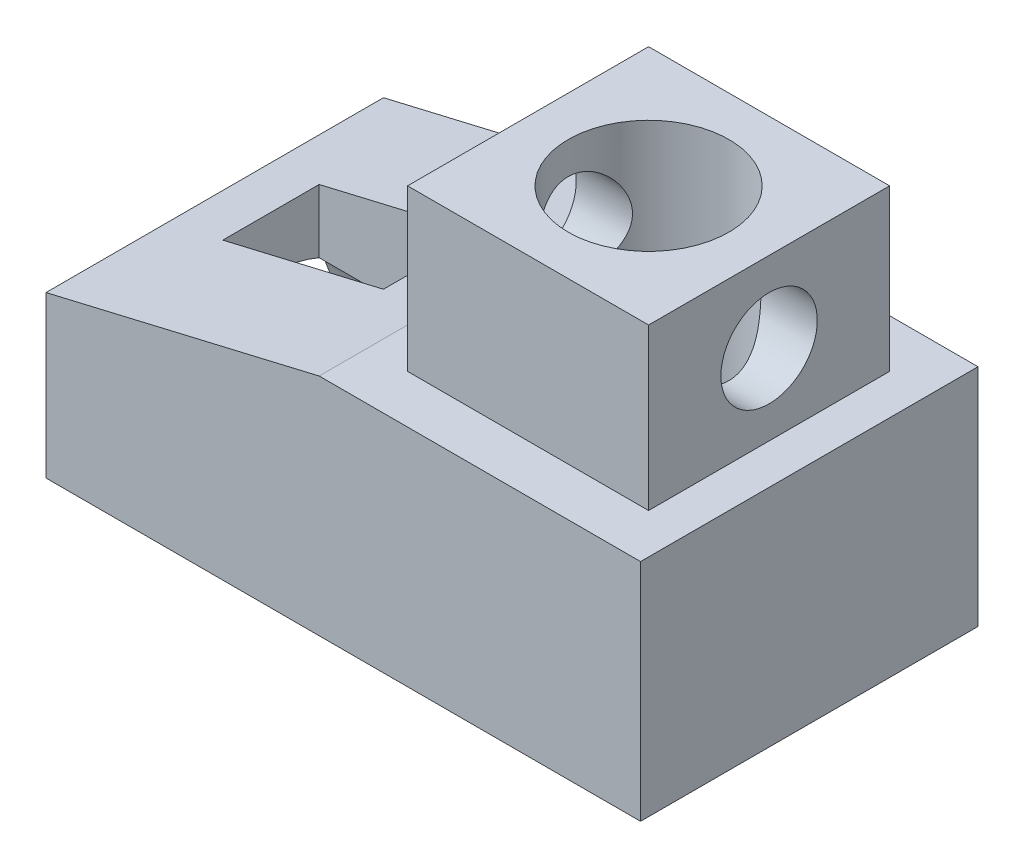
ISO-10303-21;
HEADER;
FILE_DESCRIPTION(('STEP AP214'),'2;1');
FILE_NAME('part.step','',(''),(''),'','','');
FILE_SCHEMA(('AUTOMOTIVE_DESIGN { 1 0 10303 214 1 1 1 1 }'));
ENDSEC;
DATA;
#1=APPLICATION_CONTEXT('core data for automotive mechanical design processes');
#2=APPLICATION_PROTOCOL_DEFINITION('international standard','automotive_design',2000,#1);
#3=PRODUCT_CONTEXT('',#1,'mechanical');
#4=PRODUCT('Part','Part','',(#3));
#5=PRODUCT_RELATED_PRODUCT_CATEGORY('part','',(#4));
#6=PRODUCT_DEFINITION_FORMATION('','',#4);
#7=PRODUCT_DEFINITION_CONTEXT('part definition',#1,'design');
#8=PRODUCT_DEFINITION('design','',#6,#7);
#9=PRODUCT_DEFINITION_SHAPE('','',#8);
#10=(LENGTH_UNIT() NAMED_UNIT(*) SI_UNIT(.MILLI.,.METRE.));
#11=(NAMED_UNIT(*) PLANE_ANGLE_UNIT() SI_UNIT($,.RADIAN.));
#12=(NAMED_UNIT(*) SI_UNIT($,.STERADIAN.) SOLID_ANGLE_UNIT());
#13=UNCERTAINTY_MEASURE_WITH_UNIT(LENGTH_MEASURE(1.E-05),#10,'distance_accuracy_value','');
#14=(GEOMETRIC_REPRESENTATION_CONTEXT(3) GLOBAL_UNCERTAINTY_ASSIGNED_CONTEXT((#13)) GLOBAL_UNIT_ASSIGNED_CONTEXT((#10,
#11,#12)) REPRESENTATION_CONTEXT('',''));
#15=CARTESIAN_POINT('',(0.,0.,0.));
#16=DIRECTION('',(0.,0.,1.));
#17=DIRECTION('',(1.,0.,0.));
#18=AXIS2_PLACEMENT_3D('',#15,#16,#17);
#19=CARTESIAN_POINT('',(81.,38.,21.));
#20=DIRECTION('',(-1.,0.,0.));
#21=DIRECTION('',(0.,0.,1.));
#22=AXIS2_PLACEMENT_3D('',#19,#20,#21);
#23=CYLINDRICAL_SURFACE('',#22,6.);
#24=CARTESIAN_POINT('',(62.,38.,27.));
#25=CARTESIAN_POINT('',(61.9999986491022,38.1509543565746,27.0000008816288));
#26=CARTESIAN_POINT('',(62.0042883367909,38.3018983145567,26.9942947185348));
#27=CARTESIAN_POINT('',(62.021248632191,38.602444063952,26.9715802959581));
#28=CARTESIAN_POINT('',(62.0339186819352,38.7520459440491,26.9545727889222));
#29=CARTESIAN_POINT('',(62.0671073495018,39.0487981017518,26.9095310849097));
#30=CARTESIAN_POINT('',(62.0876314862447,39.1959465793494,26.8814891338421));
#31=CARTESIAN_POINT('',(62.1356997097577,39.4866780912744,26.8148147656677));
#32=CARTESIAN_POINT('',(62.1632471209812,39.6302594016697,26.7761773325531));
#33=CARTESIAN_POINT('',(62.2544806861303,40.0521394481308,26.6457752185362));
#34=CARTESIAN_POINT('',(62.3270657253365,40.3240692031291,26.5391299189045));
#35=CARTESIAN_POINT('',(62.4874371155289,40.8457959775615,26.2901126299397));
#36=CARTESIAN_POINT('',(62.5752279984151,41.0955863650032,26.1477299838664));
#37=CARTESIAN_POINT('',(62.7691541156373,41.5998079108103,25.8108283424081));
#38=CARTESIAN_POINT('',(62.8762198499495,41.8510722444908,25.6120632809818));
#39=CARTESIAN_POINT('',(63.0358223123053,42.202012314778,25.2858687115547));
#40=CARTESIAN_POINT('',(63.08889374486,42.3147357489974,25.1723738032369));
#41=CARTESIAN_POINT('',(63.1935858740914,42.5311141830252,24.9363214663246));
#42=CARTESIAN_POINT('',(63.2452063019244,42.634767509735,24.8137623733853));
#43=CARTESIAN_POINT('',(63.3512969598774,42.8431024453444,24.5462842286701));
#44=CARTESIAN_POINT('',(63.4054690959747,42.9466763949603,24.4003817195654));
#45=CARTESIAN_POINT('',(63.5091026304158,43.1409905104534,24.0987702572981));
#46=CARTESIAN_POINT('',(63.5585661302045,43.231736410289,23.9430657307701));
#47=CARTESIAN_POINT('',(63.6513761573411,43.399438628316,23.6227331627158));
#48=CARTESIAN_POINT('',(63.6947253107895,43.4764008704179,23.458108994469));
#49=CARTESIAN_POINT('',(63.7740083496334,43.615559747051,23.1210186151927));
#50=CARTESIAN_POINT('',(63.8099434534883,43.6777588080855,22.9485536984429));
#51=CARTESIAN_POINT('',(63.8702153387099,43.7812406503287,22.6139788731018));
#52=CARTESIAN_POINT('',(63.8953316196824,43.8239528960747,22.4524510641763));
#53=CARTESIAN_POINT('',(63.9378378885394,43.8958855303524,22.1254138002954));
#54=CARTESIAN_POINT('',(63.9552283243657,43.9251067010959,21.9599045767679));
#55=CARTESIAN_POINT('',(63.9817559363516,43.9695703176477,21.6264934342495));
#56=CARTESIAN_POINT('',(63.9908995745911,43.9848237085646,21.4585934935768));
#57=CARTESIAN_POINT('',(64.0006753626941,44.0011292561628,21.1218645402546));
#58=CARTESIAN_POINT('',(64.001308378531,44.0021828577023,20.9530356238792));
#59=CARTESIAN_POINT('',(63.9945013490841,43.9908321342963,20.6370525959578));
#60=CARTESIAN_POINT('',(63.988055423997,43.9800850496281,20.4898138707286));
#61=CARTESIAN_POINT('',(63.9687793917165,43.9478341260844,20.1968909842558));
#62=CARTESIAN_POINT('',(63.9559472038078,43.9263267813845,20.0512073454886));
#63=CARTESIAN_POINT('',(63.9241981232537,43.8728332829292,19.762512301934));
#64=CARTESIAN_POINT('',(63.9052833685438,43.8408508109587,19.6194999768779));
#65=CARTESIAN_POINT('',(63.8617806390787,43.7667682162435,19.3369526643114));
#66=CARTESIAN_POINT('',(63.8371904755773,43.7246641898162,19.1974190414403));
#67=CARTESIAN_POINT('',(63.7827138055119,43.6305392014372,18.9219422869072));
#68=CARTESIAN_POINT('',(63.7527997106126,43.5784664703812,18.786022314486));
#69=CARTESIAN_POINT('',(63.6883732750741,43.4650477824947,18.5192153951276));
#70=CARTESIAN_POINT('',(63.6538592991051,43.4036985266659,18.3883302595779));
#71=CARTESIAN_POINT('',(63.5444115972231,43.2065161682298,18.004179941143));
#72=CARTESIAN_POINT('',(63.4635338585071,43.0574840347907,17.7592334652929));
#73=CARTESIAN_POINT('',(63.2815131317084,42.7086348713407,17.2676670530821));
#74=CARTESIAN_POINT('',(63.1791034522392,42.5048780951204,17.024341914746));
#75=CARTESIAN_POINT('',(62.9702060080898,42.0623521447699,16.5731247750403));
#76=CARTESIAN_POINT('',(62.863712870229,41.8235355818848,16.3652815686283));
#77=CARTESIAN_POINT('',(62.7022689464817,41.4272794048551,16.0720214989787));
#78=CARTESIAN_POINT('',(62.6453230939149,41.2804716711562,15.9730709842656));
#79=CARTESIAN_POINT('',(62.5350063250197,40.9776206053789,15.7879700328593));
#80=CARTESIAN_POINT('',(62.4816359973245,40.8215757605345,15.7018217009404));
#81=CARTESIAN_POINT('',(62.3805146003572,40.5012170022523,15.5432781474737));
#82=CARTESIAN_POINT('',(62.3327551522787,40.3369159555939,15.4708623170464));
#83=CARTESIAN_POINT('',(62.244794220076,40.000726632359,15.3405338020463));
#84=CARTESIAN_POINT('',(62.2045897684889,39.8288413676184,15.2826154201634));
#85=CARTESIAN_POINT('',(62.1424912892808,39.5221067252902,15.1946603056675));
#86=CARTESIAN_POINT('',(62.1185285023576,39.3886289376319,15.1612708760084));
#87=CARTESIAN_POINT('',(62.0767518417458,39.1187811646783,15.1036153800332));
#88=CARTESIAN_POINT('',(62.0589366105629,38.9824118249601,15.0793472994483));
#89=CARTESIAN_POINT('',(62.0300852439066,38.7077432735224,15.0402749388023));
#90=CARTESIAN_POINT('',(62.0190425991827,38.5694460459226,15.0254615710933));
#91=CARTESIAN_POINT('',(62.0041181849722,38.2917632824482,15.0054817203489));
#92=CARTESIAN_POINT('',(62.0002365673514,38.1523777235559,15.0003154419017));
#93=CARTESIAN_POINT('',(61.9997841667535,37.8733812778339,14.999712203597));
#94=CARTESIAN_POINT('',(62.00322344791,37.7337703447989,15.004288637172));
#95=CARTESIAN_POINT('',(62.017299675006,37.4555749038969,15.0231243878153));
#96=CARTESIAN_POINT('',(62.0279366584356,37.3169904013798,15.0373837553184));
#97=CARTESIAN_POINT('',(62.0560211591692,37.0417603550478,15.0753835591432));
#98=CARTESIAN_POINT('',(62.0734719572314,36.9051157781758,15.0991285627959));
#99=CARTESIAN_POINT('',(62.114568969023,36.634666944246,15.1557732694269));
#100=CARTESIAN_POINT('',(62.1382177117574,36.5008638707816,15.1886767097479));
#101=CARTESIAN_POINT('',(62.2172614819467,36.1052987729475,15.3004408422679));
#102=CARTESIAN_POINT('',(62.280824556243,35.8487461118599,15.3924452821131));
#103=CARTESIAN_POINT('',(62.4228619015266,35.3540524646882,15.6081520667899));
#104=CARTESIAN_POINT('',(62.5013417943129,35.1159184679258,15.7318663684708));
#105=CARTESIAN_POINT('',(62.6814821541945,34.6190272848439,16.0333220527565));
#106=CARTESIAN_POINT('',(62.7847709613025,34.3642915669707,16.2167825928053));
#107=CARTESIAN_POINT('',(62.9408207934403,34.0062804640016,16.5195194550488));
#108=CARTESIAN_POINT('',(62.9930647785964,33.8908780899056,16.6251160825031));
#109=CARTESIAN_POINT('',(63.0968447625405,33.6684568173622,16.8452196341281));
#110=CARTESIAN_POINT('',(63.1483806343748,33.5614394064447,16.9597281321544));
#111=CARTESIAN_POINT('',(63.2562394949588,33.3429474632705,17.2127408347878));
#112=CARTESIAN_POINT('',(63.3123098000297,33.2327130882487,17.3524265517845));
#113=CARTESIAN_POINT('',(63.4205941057635,33.0245106777257,17.6419820196453));
#114=CARTESIAN_POINT('',(63.4728096631209,32.9265376793757,17.7918476120174));
#115=CARTESIAN_POINT('',(63.5719536933945,32.743747353506,18.1010263284484));
#116=CARTESIAN_POINT('',(63.6188833561554,32.6589270637114,18.2603373139943));
#117=CARTESIAN_POINT('',(63.7060941907275,32.503418338219,18.5874551187184));
#118=CARTESIAN_POINT('',(63.7463762688217,32.432727975872,18.7552607757122));
#119=CARTESIAN_POINT('',(63.8164030937902,32.3110581490883,19.0856738300527));
#120=CARTESIAN_POINT('',(63.8467005700425,32.2590201922606,19.2477740092927));
#121=CARTESIAN_POINT('',(63.8996382046549,32.1686898439974,19.5769929290668));
#122=CARTESIAN_POINT('',(63.9222786478498,32.130396941255,19.7441114826701));
#123=CARTESIAN_POINT('',(63.9591988761294,32.068198543343,20.0817561638988));
#124=CARTESIAN_POINT('',(63.9734865352764,32.0442794975272,20.2522789250538));
#125=CARTESIAN_POINT('',(63.9932810158827,32.0111901039498,20.5952482719609));
#126=CARTESIAN_POINT('',(63.9987889820075,32.002017833554,20.767694603972));
#127=CARTESIAN_POINT('',(64.0007158823897,31.9988073305453,21.0897214575485));
#128=CARTESIAN_POINT('',(63.9982501410171,32.0029120029425,21.2392808698848));
#129=CARTESIAN_POINT('',(63.9866626014441,32.022250322847,21.5374189927015));
#130=CARTESIAN_POINT('',(63.9775409702157,32.037483691176,21.6859977276892));
#131=CARTESIAN_POINT('',(63.952860128368,32.0788768012088,21.9810691741033));
#132=CARTESIAN_POINT('',(63.9373012306182,32.105036011886,22.1275619865536));
#133=CARTESIAN_POINT('',(63.9001089462329,32.1679506204853,22.417464039973));
#134=CARTESIAN_POINT('',(63.8784753775416,32.2047063359818,22.5608731883872));
#135=CARTESIAN_POINT('',(63.8300129482367,32.2877086715288,22.8414045113159));
#136=CARTESIAN_POINT('',(63.8032745244508,32.3337908137989,22.9785910626981));
#137=CARTESIAN_POINT('',(63.7449368081526,32.4353336059767,23.2483976665547));
#138=CARTESIAN_POINT('',(63.7133359421389,32.4907972923599,23.3810162237493));
#139=CARTESIAN_POINT('',(63.6121565237022,32.6705139558693,23.7709911869535));
#140=CARTESIAN_POINT('',(63.5361657432808,32.8081516823146,24.0206641926172));
#141=CARTESIAN_POINT('',(63.3637341877833,33.131708059679,24.5210906583849));
#142=CARTESIAN_POINT('',(63.2659689306676,33.3212460023392,24.7690189108485));
#143=CARTESIAN_POINT('',(63.0640611320437,33.7350410007379,25.2316059300312));
#144=CARTESIAN_POINT('',(62.9599116037015,33.9593365198765,25.4462273056391));
#145=CARTESIAN_POINT('',(62.7990921712019,34.3340942275925,25.753066995132));
#146=CARTESIAN_POINT('',(62.7415263703341,34.4740909355688,25.8578442024867));
#147=CARTESIAN_POINT('',(62.6288705170943,34.7634621679812,26.0552437102908));
#148=CARTESIAN_POINT('',(62.5737810751154,34.9128389829893,26.1478630246498));
#149=CARTESIAN_POINT('',(62.467931695323,35.2203071623597,26.320184828098));
#150=CARTESIAN_POINT('',(62.4171712117372,35.378397424027,26.3998889466109));
#151=CARTESIAN_POINT('',(62.3219291443925,35.7025090858776,26.5455447710769));
#152=CARTESIAN_POINT('',(62.277443346982,35.8685250624509,26.6115057203459));
#153=CARTESIAN_POINT('',(62.2001088883765,36.1932108824995,26.7238508101942));
#154=CARTESIAN_POINT('',(62.1665934341749,36.351310546738,26.771420455495));
#155=CARTESIAN_POINT('',(62.1078973905326,36.6722735524312,26.8535934546686));
#156=CARTESIAN_POINT('',(62.082711372931,36.8351337159181,26.8882052549119));
#157=CARTESIAN_POINT('',(62.041900383236,37.1640903371109,26.9438231296306));
#158=CARTESIAN_POINT('',(62.0262603426594,37.3301812650538,26.9648506501999));
#159=CARTESIAN_POINT('',(62.0053115524223,37.6641859048316,26.9929377161358));
#160=CARTESIAN_POINT('',(62.0000015025506,37.8320993845906,26.9999990193988));
#161=CARTESIAN_POINT('',(62.,38.,27.));
#162=B_SPLINE_CURVE_WITH_KNOTS('',3,(#24,#25,#26,#27,#28,#29,#30,#31,#32,#33,#34,#35,#36,#37,
#38,#39,#40,#41,#42,#43,#44,#45,#46,#47,#48,#49,#50,#51,#52,#53,#54,#55,#56,#57,#58,#59,#60,#61,
#62,#63,#64,#65,#66,#67,#68,#69,#70,#71,#72,#73,#74,#75,#76,#77,#78,#79,#80,#81,#82,#83,#84,#85,
#86,#87,#88,#89,#90,#91,#92,#93,#94,#95,#96,#97,#98,#99,#100,#101,#102,#103,#104,#105,#106,#107,
#108,#109,#110,#111,#112,#113,#114,#115,#116,#117,#118,#119,#120,#121,#122,#123,#124,#125,#126,
#127,#128,#129,#130,#131,#132,#133,#134,#135,#136,#137,#138,#139,#140,#141,#142,#143,#144,#145,
#146,#147,#148,#149,#150,#151,#152,#153,#154,#155,#156,#157,#158,#159,#160,#161),.UNSPECIFIED.,
.T.,.F.,(4,2,2,2,2,2,2,2,2,2,2,2,2,2,2,2,2,2,2,2,2,2,2,2,2,2,2,2,2,2,2,2,2,2,2,2,2,2,2,2,2,2,2,
2,2,2,2,2,2,2,2,2,2,2,2,2,2,2,2,2,2,2,2,2,2,2,2,2,4),(0.,0.452678131953077,0.905326127479809,
1.35829277610848,1.81147423500294,2.71030243772274,3.60939898666924,4.61842643340733,
5.12364477538536,5.62895611582987,6.18907007252824,6.7489328690842,7.30855446857233,
7.86808402384475,8.37422610792176,8.88033884221517,9.38605464793526,9.89171899563242,
10.3345024918992,10.777430346487,11.2202026880973,11.6631460729563,12.1084553973056,
12.5539234605076,13.4442631938077,14.4409496612456,15.4389959252679,15.9963343187221,
16.5537642416308,17.1103508709196,17.6667184242242,18.0852817260551,18.5037525421122,
18.9218205257131,19.3398973752831,19.7585493316179,20.1772034685705,20.5960594308092,
21.0150865695569,21.8512278120472,22.6876848036401,23.6749363767384,24.1693355999537,
24.6638223341295,25.2228243825863,25.7815994355499,26.3402484569055,26.8988212531045,
27.4168373395204,27.9348341540781,28.4523418690018,28.9697821075672,29.4181370808688,
29.8664808069716,30.3148027448461,30.7631381201982,31.2041651922951,31.6453352834275,
32.5270550916606,33.5044950178567,34.4830244255554,35.0347612934609,35.5866334204804,
36.1384358671919,36.6898659785695,37.1945532695295,37.6989110127382,38.2024705458659,
38.7059666930588),.UNSPECIFIED.);
#163=CARTESIAN_POINT('',(62.,38.,27.));
#164=VERTEX_POINT('',#163);
#165=EDGE_CURVE('E439',#164,#164,#162,.T.);
#166=ORIENTED_EDGE('',*,*,#165,.T.);
#167=EDGE_LOOP('',(#166));
#168=FACE_BOUND('',#167,.T.);
#169=CARTESIAN_POINT('',(69.,38.,21.));
#170=DIRECTION('',(-1.,0.,0.));
#171=DIRECTION('',(0.,0.,1.));
#172=AXIS2_PLACEMENT_3D('',#169,#170,#171);
#173=CIRCLE('',#172,6.);
#174=CARTESIAN_POINT('',(69.,38.,27.));
#175=VERTEX_POINT('',#174);
#176=EDGE_CURVE('E208',#175,#175,#173,.T.);
#177=ORIENTED_EDGE('',*,*,#176,.F.);
#178=EDGE_LOOP('',(#177));
#179=FACE_BOUND('',#178,.T.);
#180=ADVANCED_FACE('F44',(#168,#179),#23,.F.);
#181=CARTESIAN_POINT('',(69.,48.,42.));
#182=DIRECTION('',(-1.,0.,0.));
#183=DIRECTION('',(0.,0.,1.));
#184=AXIS2_PLACEMENT_3D('',#181,#182,#183);
#185=PLANE('',#184);
#186=ORIENTED_EDGE('',*,*,#176,.T.);
#187=EDGE_LOOP('',(#186));
#188=FACE_BOUND('',#187,.T.);
#189=DIRECTION('',(0.,-1.,0.));
#190=VECTOR('',#189,1.);
#191=CARTESIAN_POINT('',(69.,0.,6.));
#192=LINE('',#191,#190);
#193=CARTESIAN_POINT('',(69.,48.,6.));
#194=VERTEX_POINT('',#193);
#195=CARTESIAN_POINT('',(69.,28.,6.));
#196=VERTEX_POINT('',#195);
#197=EDGE_CURVE('E212',#194,#196,#192,.T.);
#198=ORIENTED_EDGE('',*,*,#197,.F.);
#199=DIRECTION('',(0.,0.,-1.));
#200=VECTOR('',#199,1.);
#201=CARTESIAN_POINT('',(69.,48.,42.));
#202=LINE('',#201,#200);
#203=CARTESIAN_POINT('',(69.,48.,36.));
#204=VERTEX_POINT('',#203);
#205=EDGE_CURVE('E305',#204,#194,#202,.T.);
#206=ORIENTED_EDGE('',*,*,#205,.F.);
#207=DIRECTION('',(0.,1.,0.));
#208=VECTOR('',#207,1.);
#209=CARTESIAN_POINT('',(69.,0.,36.));
#210=LINE('',#209,#208);
#211=CARTESIAN_POINT('',(69.,28.,36.));
#212=VERTEX_POINT('',#211);
#213=EDGE_CURVE('E231',#212,#204,#210,.T.);
#214=ORIENTED_EDGE('',*,*,#213,.F.);
#215=DIRECTION('',(0.,0.,-1.));
#216=VECTOR('',#215,1.);
#217=CARTESIAN_POINT('',(69.,28.,42.));
#218=LINE('',#217,#216);
#219=EDGE_CURVE('E309',#212,#196,#218,.T.);
#220=ORIENTED_EDGE('',*,*,#219,.T.);
#221=EDGE_LOOP('',(#198,#206,#214,#220));
#222=FACE_BOUND('',#221,.T.);
#223=ADVANCED_FACE('F375',(#188,#222),#185,.F.);
#224=CARTESIAN_POINT('',(39.,48.,42.));
#225=DIRECTION('',(0.,-1.,0.));
#226=DIRECTION('',(0.,0.,-1.));
#227=AXIS2_PLACEMENT_3D('',#224,#225,#226);
#228=PLANE('',#227);
#229=CARTESIAN_POINT('',(54.,48.,21.));
#230=DIRECTION('',(0.,1.,0.));
#231=DIRECTION('',(0.,0.,1.));
#232=AXIS2_PLACEMENT_3D('',#229,#230,#231);
#233=CIRCLE('',#232,9.99999999999999);
#234=CARTESIAN_POINT('',(54.,48.,31.));
#235=VERTEX_POINT('',#234);
#236=EDGE_CURVE('E445',#235,#235,#233,.T.);
#237=ORIENTED_EDGE('',*,*,#236,.F.);
#238=EDGE_LOOP('',(#237));
#239=FACE_BOUND('',#238,.T.);
#240=DIRECTION('',(1.,0.,0.));
#241=VECTOR('',#240,1.);
#242=CARTESIAN_POINT('',(0.,48.,6.));
#243=LINE('',#242,#241);
#244=CARTESIAN_POINT('',(39.,48.,6.));
#245=VERTEX_POINT('',#244);
#246=EDGE_CURVE('E222',#245,#194,#243,.T.);
#247=ORIENTED_EDGE('',*,*,#246,.F.);
#248=DIRECTION('',(0.,0.,-1.));
#249=VECTOR('',#248,1.);
#250=CARTESIAN_POINT('',(39.,48.,42.));
#251=LINE('',#250,#249);
#252=CARTESIAN_POINT('',(39.,48.,36.));
#253=VERTEX_POINT('',#252);
#254=EDGE_CURVE('E301',#253,#245,#251,.T.);
#255=ORIENTED_EDGE('',*,*,#254,.F.);
#256=DIRECTION('',(-1.,0.,0.));
#257=VECTOR('',#256,1.);
#258=CARTESIAN_POINT('',(0.,48.,36.));
#259=LINE('',#258,#257);
#260=EDGE_CURVE('E66',#204,#253,#259,.T.);
#261=ORIENTED_EDGE('',*,*,#260,.F.);
#262=ORIENTED_EDGE('',*,*,#205,.T.);
#263=EDGE_LOOP('',(#247,#255,#261,#262));
#264=FACE_BOUND('',#263,.T.);
#265=ADVANCED_FACE('F383',(#239,#264),#228,.F.);
#266=CARTESIAN_POINT('',(39.,48.,42.));
#267=DIRECTION('',(1.,0.,0.));
#268=DIRECTION('',(0.,0.,-1.));
#269=AXIS2_PLACEMENT_3D('',#266,#267,#268);
#270=PLANE('',#269);
#271=CARTESIAN_POINT('',(39.,38.,21.));
#272=DIRECTION('',(-1.,0.,0.));
#273=DIRECTION('',(0.,0.,1.));
#274=AXIS2_PLACEMENT_3D('',#271,#272,#273);
#275=CIRCLE('',#274,6.);
#276=CARTESIAN_POINT('',(39.,38.,27.));
#277=VERTEX_POINT('',#276);
#278=EDGE_CURVE('E204',#277,#277,#275,.T.);
#279=ORIENTED_EDGE('',*,*,#278,.F.);
#280=EDGE_LOOP('',(#279));
#281=FACE_BOUND('',#280,.T.);
#282=DIRECTION('',(0.,1.,0.));
#283=VECTOR('',#282,1.);
#284=CARTESIAN_POINT('',(39.,0.,6.));
#285=LINE('',#284,#283);
#286=CARTESIAN_POINT('',(39.,28.,6.));
#287=VERTEX_POINT('',#286);
#288=EDGE_CURVE('E219',#287,#245,#285,.T.);
#289=ORIENTED_EDGE('',*,*,#288,.F.);
#290=DIRECTION('',(0.,0.,-1.));
#291=VECTOR('',#290,1.);
#292=CARTESIAN_POINT('',(39.,28.,42.));
#293=LINE('',#292,#291);
#294=CARTESIAN_POINT('',(39.,28.,36.));
#295=VERTEX_POINT('',#294);
#296=EDGE_CURVE('E284',#295,#287,#293,.T.);
#297=ORIENTED_EDGE('',*,*,#296,.F.);
#298=DIRECTION('',(0.,-1.,0.));
#299=VECTOR('',#298,1.);
#300=CARTESIAN_POINT('',(39.,0.,36.));
#301=LINE('',#300,#299);
#302=EDGE_CURVE('E225',#253,#295,#301,.T.);
#303=ORIENTED_EDGE('',*,*,#302,.F.);
#304=ORIENTED_EDGE('',*,*,#254,.T.);
#305=EDGE_LOOP('',(#289,#297,#303,#304));
#306=FACE_BOUND('',#305,.T.);
#307=ADVANCED_FACE('F407',(#281,#306),#270,.F.);
#308=CARTESIAN_POINT('',(0.,0.,42.));
#309=DIRECTION('',(1.,0.,0.));
#310=DIRECTION('',(0.,0.,-1.));
#311=AXIS2_PLACEMENT_3D('',#308,#309,#310);
#312=PLANE('',#311);
#313=DIRECTION('',(0.,0.,-1.));
#314=VECTOR('',#313,1.);
#315=CARTESIAN_POINT('',(0.,0.,42.));
#316=LINE('',#315,#314);
#317=CARTESIAN_POINT('',(0.,0.,6.));
#318=VERTEX_POINT('',#317);
#319=CARTESIAN_POINT('',(0.,0.,0.));
#320=VERTEX_POINT('',#319);
#321=EDGE_CURVE('E321',#318,#320,#316,.T.);
#322=ORIENTED_EDGE('',*,*,#321,.F.);
#323=CARTESIAN_POINT('',(0.,0.,21.));
#324=DIRECTION('',(-1.,0.,0.));
#325=DIRECTION('',(0.,0.,1.));
#326=AXIS2_PLACEMENT_3D('',#323,#324,#325);
#327=CIRCLE('',#326,15.);
#328=CARTESIAN_POINT('',(0.,0.,36.));
#329=VERTEX_POINT('',#328);
#330=EDGE_CURVE('E443',#329,#318,#327,.T.);
#331=ORIENTED_EDGE('',*,*,#330,.F.);
#332=CARTESIAN_POINT('',(0.,0.,42.));
#333=VERTEX_POINT('',#332);
#334=EDGE_CURVE('E59',#333,#329,#316,.T.);
#335=ORIENTED_EDGE('',*,*,#334,.F.);
#336=DIRECTION('',(0.,-1.,0.));
#337=VECTOR('',#336,1.);
#338=CARTESIAN_POINT('',(0.,0.,42.));
#339=LINE('',#338,#337);
#340=CARTESIAN_POINT('',(0.,20.,42.));
#341=VERTEX_POINT('',#340);
#342=EDGE_CURVE('E271',#341,#333,#339,.T.);
#343=ORIENTED_EDGE('',*,*,#342,.F.);
#344=DIRECTION('',(0.,0.,1.));
#345=VECTOR('',#344,1.);
#346=CARTESIAN_POINT('',(0.,20.,-3.));
#347=LINE('',#346,#345);
#348=CARTESIAN_POINT('',(0.,20.,0.));
#349=VERTEX_POINT('',#348);
#350=EDGE_CURVE('E240',#349,#341,#347,.T.);
#351=ORIENTED_EDGE('',*,*,#350,.F.);
#352=DIRECTION('',(0.,-1.,0.));
#353=VECTOR('',#352,1.);
#354=CARTESIAN_POINT('',(0.,0.,0.));
#355=LINE('',#354,#353);
#356=EDGE_CURVE('E172',#349,#320,#355,.T.);
#357=ORIENTED_EDGE('',*,*,#356,.T.);
#358=EDGE_LOOP('',(#322,#331,#335,#343,#351,#357));
#359=FACE_BOUND('',#358,.T.);
#360=ADVANCED_FACE('F46',(#359),#312,.F.);
#361=CARTESIAN_POINT('',(0.,0.,42.));
#362=DIRECTION('',(0.,0.,-1.));
#363=DIRECTION('',(-1.,0.,0.));
#364=AXIS2_PLACEMENT_3D('',#361,#362,#363);
#365=PLANE('',#364);
#366=DIRECTION('',(-1.,0.,0.));
#367=VECTOR('',#366,1.);
#368=CARTESIAN_POINT('',(69.,28.,42.));
#369=LINE('',#368,#367);
#370=CARTESIAN_POINT('',(74.,28.,42.));
#371=VERTEX_POINT('',#370);
#372=CARTESIAN_POINT('',(34.0000000000001,28.,42.));
#373=VERTEX_POINT('',#372);
#374=EDGE_CURVE('E281',#371,#373,#369,.T.);
#375=ORIENTED_EDGE('',*,*,#374,.T.);
#376=DIRECTION('',(-0.973417168333576,-0.229039333725547,0.));
#377=VECTOR('',#376,1.);
#378=CARTESIAN_POINT('',(-4.45901639344262,18.9508196721311,42.));
#379=LINE('',#378,#377);
#380=EDGE_CURVE('E236',#373,#341,#379,.T.);
#381=ORIENTED_EDGE('',*,*,#380,.T.);
#382=ORIENTED_EDGE('',*,*,#342,.T.);
#383=DIRECTION('',(1.,0.,0.));
#384=VECTOR('',#383,1.);
#385=CARTESIAN_POINT('',(0.,0.,42.));
#386=LINE('',#385,#384);
#387=CARTESIAN_POINT('',(74.,0.,42.));
#388=VERTEX_POINT('',#387);
#389=EDGE_CURVE('E274',#333,#388,#386,.T.);
#390=ORIENTED_EDGE('',*,*,#389,.T.);
#391=DIRECTION('',(0.,1.,0.));
#392=VECTOR('',#391,1.);
#393=CARTESIAN_POINT('',(74.,0.,42.));
#394=LINE('',#393,#392);
#395=EDGE_CURVE('E278',#388,#371,#394,.T.);
#396=ORIENTED_EDGE('',*,*,#395,.T.);
#397=EDGE_LOOP('',(#375,#381,#382,#390,#396));
#398=FACE_BOUND('',#397,.T.);
#399=ADVANCED_FACE('F345',(#398),#365,.F.);
#400=CARTESIAN_POINT('',(0.,0.,0.));
#401=DIRECTION('',(0.,0.,-1.));
#402=DIRECTION('',(-1.,0.,0.));
#403=AXIS2_PLACEMENT_3D('',#400,#401,#402);
#404=PLANE('',#403);
#405=DIRECTION('',(-1.,0.,0.));
#406=VECTOR('',#405,1.);
#407=CARTESIAN_POINT('',(0.,28.,0.));
#408=LINE('',#407,#406);
#409=CARTESIAN_POINT('',(74.,28.,0.));
#410=VERTEX_POINT('',#409);
#411=CARTESIAN_POINT('',(34.0000000000001,28.,0.));
#412=VERTEX_POINT('',#411);
#413=EDGE_CURVE('E275',#410,#412,#408,.T.);
#414=ORIENTED_EDGE('',*,*,#413,.F.);
#415=DIRECTION('',(0.,1.,0.));
#416=VECTOR('',#415,1.);
#417=CARTESIAN_POINT('',(74.,0.,0.));
#418=LINE('',#417,#416);
#419=CARTESIAN_POINT('',(74.,0.,0.));
#420=VERTEX_POINT('',#419);
#421=EDGE_CURVE('E291',#420,#410,#418,.T.);
#422=ORIENTED_EDGE('',*,*,#421,.F.);
#423=DIRECTION('',(1.,0.,0.));
#424=VECTOR('',#423,1.);
#425=CARTESIAN_POINT('',(0.,0.,0.));
#426=LINE('',#425,#424);
#427=EDGE_CURVE('E288',#320,#420,#426,.T.);
#428=ORIENTED_EDGE('',*,*,#427,.F.);
#429=ORIENTED_EDGE('',*,*,#356,.F.);
#430=DIRECTION('',(0.973417168333576,0.229039333725547,0.));
#431=VECTOR('',#430,1.);
#432=CARTESIAN_POINT('',(-4.45901639344262,18.9508196721311,0.));
#433=LINE('',#432,#431);
#434=EDGE_CURVE('E257',#349,#412,#433,.T.);
#435=ORIENTED_EDGE('',*,*,#434,.T.);
#436=EDGE_LOOP('',(#414,#422,#428,#429,#435));
#437=FACE_BOUND('',#436,.T.);
#438=ADVANCED_FACE('F335',(#437),#404,.T.);
#439=CARTESIAN_POINT('',(7.,-14.,27.));
#440=DIRECTION('',(0.,0.,1.));
#441=DIRECTION('',(1.,0.,0.));
#442=AXIS2_PLACEMENT_3D('',#439,#440,#441);
#443=PLANE('',#442);
#444=DIRECTION('',(0.,1.,0.));
#445=VECTOR('',#444,1.);
#446=CARTESIAN_POINT('',(27.,-14.,27.));
#447=LINE('',#446,#445);
#448=CARTESIAN_POINT('',(27.,13.7477270848675,27.));
#449=VERTEX_POINT('',#448);
#450=CARTESIAN_POINT('',(27.,26.3529411764706,27.));
#451=VERTEX_POINT('',#450);
#452=EDGE_CURVE('E260',#449,#451,#447,.T.);
#453=ORIENTED_EDGE('',*,*,#452,.F.);
#454=DIRECTION('',(-1.,0.,0.));
#455=VECTOR('',#454,1.);
#456=CARTESIAN_POINT('',(27.,13.7477270848675,27.));
#457=LINE('',#456,#455);
#458=CARTESIAN_POINT('',(7.,13.7477270848675,27.));
#459=VERTEX_POINT('',#458);
#460=EDGE_CURVE('E180',#449,#459,#457,.T.);
#461=ORIENTED_EDGE('',*,*,#460,.T.);
#462=DIRECTION('',(0.,1.,0.));
#463=VECTOR('',#462,1.);
#464=CARTESIAN_POINT('',(7.,-14.,27.));
#465=LINE('',#464,#463);
#466=CARTESIAN_POINT('',(7.,21.6470588235294,27.));
#467=VERTEX_POINT('',#466);
#468=EDGE_CURVE('E173',#459,#467,#465,.T.);
#469=ORIENTED_EDGE('',*,*,#468,.T.);
#470=DIRECTION('',(-0.973417168333576,-0.229039333725547,0.));
#471=VECTOR('',#470,1.);
#472=CARTESIAN_POINT('',(-0.94754098360655,19.7770491803279,27.));
#473=LINE('',#472,#471);
#474=EDGE_CURVE('E253',#451,#467,#473,.T.);
#475=ORIENTED_EDGE('',*,*,#474,.F.);
#476=EDGE_LOOP('',(#453,#461,#469,#475));
#477=FACE_BOUND('',#476,.T.);
#478=ADVANCED_FACE('F363',(#477),#443,.F.);
#479=CARTESIAN_POINT('',(7.,-14.,15.));
#480=DIRECTION('',(-1.,0.,0.));
#481=DIRECTION('',(0.,0.,1.));
#482=AXIS2_PLACEMENT_3D('',#479,#480,#481);
#483=PLANE('',#482);
#484=ORIENTED_EDGE('',*,*,#468,.F.);
#485=CARTESIAN_POINT('',(7.,0.,21.));
#486=DIRECTION('',(-1.,0.,0.));
#487=DIRECTION('',(0.,0.,1.));
#488=AXIS2_PLACEMENT_3D('',#485,#486,#487);
#489=CIRCLE('',#488,15.);
#490=CARTESIAN_POINT('',(7.,13.7477270848675,15.));
#491=VERTEX_POINT('',#490);
#492=EDGE_CURVE('E198',#459,#491,#489,.T.);
#493=ORIENTED_EDGE('',*,*,#492,.T.);
#494=DIRECTION('',(0.,1.,0.));
#495=VECTOR('',#494,1.);
#496=CARTESIAN_POINT('',(7.,-14.,15.));
#497=LINE('',#496,#495);
#498=CARTESIAN_POINT('',(7.,21.6470588235294,15.));
#499=VERTEX_POINT('',#498);
#500=EDGE_CURVE('E263',#491,#499,#497,.T.);
#501=ORIENTED_EDGE('',*,*,#500,.T.);
#502=DIRECTION('',(0.,0.,-1.));
#503=VECTOR('',#502,1.);
#504=CARTESIAN_POINT('',(7.,21.6470588235294,15.));
#505=LINE('',#504,#503);
#506=EDGE_CURVE('E249',#467,#499,#505,.T.);
#507=ORIENTED_EDGE('',*,*,#506,.F.);
#508=EDGE_LOOP('',(#484,#493,#501,#507));
#509=FACE_BOUND('',#508,.T.);
#510=ADVANCED_FACE('F358',(#509),#483,.F.);
#511=CARTESIAN_POINT('',(7.,-14.,15.));
#512=DIRECTION('',(0.,0.,1.));
#513=DIRECTION('',(1.,0.,0.));
#514=AXIS2_PLACEMENT_3D('',#511,#512,#513);
#515=PLANE('',#514);
#516=DIRECTION('',(-1.,0.,0.));
#517=VECTOR('',#516,1.);
#518=CARTESIAN_POINT('',(27.,13.7477270848675,15.));
#519=LINE('',#518,#517);
#520=CARTESIAN_POINT('',(27.,13.7477270848675,15.));
#521=VERTEX_POINT('',#520);
#522=EDGE_CURVE('E192',#521,#491,#519,.T.);
#523=ORIENTED_EDGE('',*,*,#522,.F.);
#524=DIRECTION('',(0.,1.,0.));
#525=VECTOR('',#524,1.);
#526=CARTESIAN_POINT('',(27.,-14.,15.));
#527=LINE('',#526,#525);
#528=CARTESIAN_POINT('',(27.,26.3529411764706,15.));
#529=VERTEX_POINT('',#528);
#530=EDGE_CURVE('E266',#521,#529,#527,.T.);
#531=ORIENTED_EDGE('',*,*,#530,.T.);
#532=DIRECTION('',(-0.973417168333576,-0.229039333725547,0.));
#533=VECTOR('',#532,1.);
#534=CARTESIAN_POINT('',(-0.947540983606551,19.7770491803279,15.));
#535=LINE('',#534,#533);
#536=EDGE_CURVE('E243',#529,#499,#535,.T.);
#537=ORIENTED_EDGE('',*,*,#536,.T.);
#538=ORIENTED_EDGE('',*,*,#500,.F.);
#539=EDGE_LOOP('',(#523,#531,#537,#538));
#540=FACE_BOUND('',#539,.T.);
#541=ADVANCED_FACE('F362',(#540),#515,.T.);
#542=CARTESIAN_POINT('',(27.,-14.,15.));
#543=DIRECTION('',(-1.,0.,0.));
#544=DIRECTION('',(0.,0.,1.));
#545=AXIS2_PLACEMENT_3D('',#542,#543,#544);
#546=PLANE('',#545);
#547=CARTESIAN_POINT('',(27.,0.,21.));
#548=DIRECTION('',(-1.,0.,0.));
#549=DIRECTION('',(0.,0.,1.));
#550=AXIS2_PLACEMENT_3D('',#547,#548,#549);
#551=CIRCLE('',#550,15.);
#552=CARTESIAN_POINT('',(27.,0.,36.));
#553=VERTEX_POINT('',#552);
#554=EDGE_CURVE('E163',#553,#449,#551,.T.);
#555=ORIENTED_EDGE('',*,*,#554,.T.);
#556=ORIENTED_EDGE('',*,*,#452,.T.);
#557=DIRECTION('',(0.,0.,-1.));
#558=VECTOR('',#557,1.);
#559=CARTESIAN_POINT('',(27.,26.3529411764706,15.));
#560=LINE('',#559,#558);
#561=EDGE_CURVE('E11',#451,#529,#560,.T.);
#562=ORIENTED_EDGE('',*,*,#561,.T.);
#563=ORIENTED_EDGE('',*,*,#530,.F.);
#564=CARTESIAN_POINT('',(27.,0.,6.));
#565=VERTEX_POINT('',#564);
#566=EDGE_CURVE('E166',#521,#565,#551,.T.);
#567=ORIENTED_EDGE('',*,*,#566,.T.);
#568=DIRECTION('',(0.,0.,1.));
#569=VECTOR('',#568,1.);
#570=CARTESIAN_POINT('',(27.,0.,42.));
#571=LINE('',#570,#569);
#572=EDGE_CURVE('E160',#565,#553,#571,.T.);
#573=ORIENTED_EDGE('',*,*,#572,.T.);
#574=EDGE_LOOP('',(#555,#556,#562,#563,#567,#573));
#575=FACE_BOUND('',#574,.T.);
#576=ADVANCED_FACE('F162',(#575),#546,.T.);
#577=CARTESIAN_POINT('',(0.,0.,42.));
#578=DIRECTION('',(0.,1.,0.));
#579=DIRECTION('',(0.,0.,1.));
#580=AXIS2_PLACEMENT_3D('',#577,#578,#579);
#581=PLANE('',#580);
#582=CARTESIAN_POINT('',(54.,0.,21.));
#583=DIRECTION('',(0.,1.,0.));
#584=DIRECTION('',(0.,0.,1.));
#585=AXIS2_PLACEMENT_3D('',#582,#583,#584);
#586=CIRCLE('',#585,9.99999999999999);
#587=CARTESIAN_POINT('',(54.,0.,31.));
#588=VERTEX_POINT('',#587);
#589=EDGE_CURVE('E436',#588,#588,#586,.T.);
#590=ORIENTED_EDGE('',*,*,#589,.T.);
#591=EDGE_LOOP('',(#590));
#592=FACE_BOUND('',#591,.T.);
#593=ORIENTED_EDGE('',*,*,#572,.F.);
#594=DIRECTION('',(-1.,0.,0.));
#595=VECTOR('',#594,1.);
#596=CARTESIAN_POINT('',(27.,0.,6.));
#597=LINE('',#596,#595);
#598=EDGE_CURVE('E188',#565,#318,#597,.T.);
#599=ORIENTED_EDGE('',*,*,#598,.T.);
#600=ORIENTED_EDGE('',*,*,#321,.T.);
#601=ORIENTED_EDGE('',*,*,#427,.T.);
#602=DIRECTION('',(0.,0.,-1.));
#603=VECTOR('',#602,1.);
#604=CARTESIAN_POINT('',(74.,0.,42.));
#605=LINE('',#604,#603);
#606=EDGE_CURVE('E317',#388,#420,#605,.T.);
#607=ORIENTED_EDGE('',*,*,#606,.F.);
#608=ORIENTED_EDGE('',*,*,#389,.F.);
#609=ORIENTED_EDGE('',*,*,#334,.T.);
#610=DIRECTION('',(-1.,0.,0.));
#611=VECTOR('',#610,1.);
#612=CARTESIAN_POINT('',(27.,0.,36.));
#613=LINE('',#612,#611);
#614=EDGE_CURVE('E177',#553,#329,#613,.T.);
#615=ORIENTED_EDGE('',*,*,#614,.F.);
#616=EDGE_LOOP('',(#593,#599,#600,#601,#607,#608,#609,#615));
#617=FACE_BOUND('',#616,.T.);
#618=ADVANCED_FACE('F184',(#592,#617),#581,.F.);
#619=CARTESIAN_POINT('',(74.,0.,42.));
#620=DIRECTION('',(-1.,0.,0.));
#621=DIRECTION('',(0.,0.,1.));
#622=AXIS2_PLACEMENT_3D('',#619,#620,#621);
#623=PLANE('',#622);
#624=ORIENTED_EDGE('',*,*,#421,.T.);
#625=DIRECTION('',(0.,0.,-1.));
#626=VECTOR('',#625,1.);
#627=CARTESIAN_POINT('',(74.,28.,42.));
#628=LINE('',#627,#626);
#629=EDGE_CURVE('E313',#371,#410,#628,.T.);
#630=ORIENTED_EDGE('',*,*,#629,.F.);
#631=ORIENTED_EDGE('',*,*,#395,.F.);
#632=ORIENTED_EDGE('',*,*,#606,.T.);
#633=EDGE_LOOP('',(#624,#630,#631,#632));
#634=FACE_BOUND('',#633,.T.);
#635=ADVANCED_FACE('F338',(#634),#623,.F.);
#636=CARTESIAN_POINT('',(69.,28.,42.));
#637=DIRECTION('',(0.,-1.,0.));
#638=DIRECTION('',(0.,0.,-1.));
#639=AXIS2_PLACEMENT_3D('',#636,#637,#638);
#640=PLANE('',#639);
#641=ORIENTED_EDGE('',*,*,#629,.T.);
#642=ORIENTED_EDGE('',*,*,#413,.T.);
#643=DIRECTION('',(0.,0.,1.));
#644=VECTOR('',#643,1.);
#645=CARTESIAN_POINT('',(34.0000000000001,28.,-3.));
#646=LINE('',#645,#644);
#647=EDGE_CURVE('E74',#412,#373,#646,.T.);
#648=ORIENTED_EDGE('',*,*,#647,.T.);
#649=ORIENTED_EDGE('',*,*,#374,.F.);
#650=EDGE_LOOP('',(#641,#642,#648,#649));
#651=FACE_BOUND('',#650,.T.);
#652=DIRECTION('',(-1.,0.,0.));
#653=VECTOR('',#652,1.);
#654=CARTESIAN_POINT('',(0.,28.,6.));
#655=LINE('',#654,#653);
#656=EDGE_CURVE('E216',#196,#287,#655,.T.);
#657=ORIENTED_EDGE('',*,*,#656,.F.);
#658=ORIENTED_EDGE('',*,*,#219,.F.);
#659=DIRECTION('',(1.,0.,0.));
#660=VECTOR('',#659,1.);
#661=CARTESIAN_POINT('',(0.,28.,36.));
#662=LINE('',#661,#660);
#663=EDGE_CURVE('E228',#295,#212,#662,.T.);
#664=ORIENTED_EDGE('',*,*,#663,.F.);
#665=ORIENTED_EDGE('',*,*,#296,.T.);
#666=EDGE_LOOP('',(#657,#658,#664,#665));
#667=FACE_BOUND('',#666,.T.);
#668=ADVANCED_FACE('F342',(#651,#667),#640,.F.);
#669=CARTESIAN_POINT('',(-4.45901639344262,18.9508196721311,-3.));
#670=DIRECTION('',(-0.229039333725547,0.973417168333576,0.));
#671=DIRECTION('',(-0.973417168333576,-0.229039333725547,0.));
#672=AXIS2_PLACEMENT_3D('',#669,#670,#671);
#673=PLANE('',#672);
#674=ORIENTED_EDGE('',*,*,#350,.T.);
#675=ORIENTED_EDGE('',*,*,#380,.F.);
#676=ORIENTED_EDGE('',*,*,#647,.F.);
#677=ORIENTED_EDGE('',*,*,#434,.F.);
#678=EDGE_LOOP('',(#674,#675,#676,#677));
#679=FACE_BOUND('',#678,.T.);
#680=ORIENTED_EDGE('',*,*,#474,.T.);
#681=ORIENTED_EDGE('',*,*,#506,.T.);
#682=ORIENTED_EDGE('',*,*,#536,.F.);
#683=ORIENTED_EDGE('',*,*,#561,.F.);
#684=EDGE_LOOP('',(#680,#681,#682,#683));
#685=FACE_BOUND('',#684,.T.);
#686=ADVANCED_FACE('F346',(#679,#685),#673,.T.);
#687=CARTESIAN_POINT('',(0.,0.,36.));
#688=DIRECTION('',(0.,0.,1.));
#689=DIRECTION('',(1.,0.,0.));
#690=AXIS2_PLACEMENT_3D('',#687,#688,#689);
#691=PLANE('',#690);
#692=ORIENTED_EDGE('',*,*,#302,.T.);
#693=ORIENTED_EDGE('',*,*,#663,.T.);
#694=ORIENTED_EDGE('',*,*,#213,.T.);
#695=ORIENTED_EDGE('',*,*,#260,.T.);
#696=EDGE_LOOP('',(#692,#693,#694,#695));
#697=FACE_BOUND('',#696,.T.);
#698=ADVANCED_FACE('F349',(#697),#691,.T.);
#699=CARTESIAN_POINT('',(0.,0.,6.));
#700=DIRECTION('',(0.,0.,-1.));
#701=DIRECTION('',(-1.,0.,0.));
#702=AXIS2_PLACEMENT_3D('',#699,#700,#701);
#703=PLANE('',#702);
#704=ORIENTED_EDGE('',*,*,#197,.T.);
#705=ORIENTED_EDGE('',*,*,#656,.T.);
#706=ORIENTED_EDGE('',*,*,#288,.T.);
#707=ORIENTED_EDGE('',*,*,#246,.T.);
#708=EDGE_LOOP('',(#704,#705,#706,#707));
#709=FACE_BOUND('',#708,.T.);
#710=ADVANCED_FACE('F392',(#709),#703,.T.);
#711=CARTESIAN_POINT('',(46.,38.,27.));
#712=CARTESIAN_POINT('',(46.0000013508978,37.8490456434254,27.0000008816288));
#713=CARTESIAN_POINT('',(45.9957116632091,37.6981016854433,26.9942947185348));
#714=CARTESIAN_POINT('',(45.9787513678089,37.397555936048,26.9715802959581));
#715=CARTESIAN_POINT('',(45.9660813180648,37.2479540559509,26.9545727889222));
#716=CARTESIAN_POINT('',(45.9328926504982,36.9512018982482,26.9095310849097));
#717=CARTESIAN_POINT('',(45.9123685137552,36.8040534206506,26.8814891338421));
#718=CARTESIAN_POINT('',(45.8643002902423,36.5133219087256,26.8148147656677));
#719=CARTESIAN_POINT('',(45.8367528790188,36.3697405983302,26.7761773325531));
#720=CARTESIAN_POINT('',(45.7455193138696,35.9478605518692,26.6457752185361));
#721=CARTESIAN_POINT('',(45.6729342746634,35.6759307968708,26.5391299189045));
#722=CARTESIAN_POINT('',(45.512562884471,35.1542040224385,26.2901126299397));
#723=CARTESIAN_POINT('',(45.4247720015849,34.9044136349968,26.1477299838664));
#724=CARTESIAN_POINT('',(45.2308458843626,34.4001920891897,25.810828342408));
#725=CARTESIAN_POINT('',(45.1237801500504,34.1489277555092,25.6120632809818));
#726=CARTESIAN_POINT('',(44.9641776876947,33.797987685222,25.2858687115547));
#727=CARTESIAN_POINT('',(44.9111062551399,33.6852642510026,25.1723738032369));
#728=CARTESIAN_POINT('',(44.8064141259086,33.4688858169748,24.9363214663246));
#729=CARTESIAN_POINT('',(44.7547936980756,33.365232490265,24.8137623733853));
#730=CARTESIAN_POINT('',(44.6487030401225,33.1568975546556,24.5462842286701));
#731=CARTESIAN_POINT('',(44.5945309040253,33.0533236050396,24.4003817195654));
#732=CARTESIAN_POINT('',(44.4908973695842,32.8590094895466,24.0987702572981));
#733=CARTESIAN_POINT('',(44.4414338697955,32.768263589711,23.9430657307701));
#734=CARTESIAN_POINT('',(44.3486238426589,32.600561371684,23.6227331627158));
#735=CARTESIAN_POINT('',(44.3052746892104,32.5235991295821,23.458108994469));
#736=CARTESIAN_POINT('',(44.2259916503666,32.384440252949,23.1210186151927));
#737=CARTESIAN_POINT('',(44.1900565465117,32.3222411919145,22.9485536984429));
#738=CARTESIAN_POINT('',(44.1297846612901,32.2187593496713,22.6139788731018));
#739=CARTESIAN_POINT('',(44.1046683803175,32.1760471039253,22.4524510641762));
#740=CARTESIAN_POINT('',(44.0621621114606,32.1041144696476,22.1254138002954));
#741=CARTESIAN_POINT('',(44.0447716756343,32.0748932989041,21.9599045767679));
#742=CARTESIAN_POINT('',(44.0182440636484,32.0304296823523,21.6264934342495));
#743=CARTESIAN_POINT('',(44.0091004254088,32.0151762914354,21.4585934935768));
#744=CARTESIAN_POINT('',(43.9993246373059,31.9988707438372,21.1218645402546));
#745=CARTESIAN_POINT('',(43.998691621469,31.9978171422977,20.9530356238792));
#746=CARTESIAN_POINT('',(44.0054986509159,32.0091678657037,20.6370525959578));
#747=CARTESIAN_POINT('',(44.011944576003,32.0199149503719,20.4898138707286));
#748=CARTESIAN_POINT('',(44.0312206082835,32.0521658739156,20.1968909842558));
#749=CARTESIAN_POINT('',(44.0440527961922,32.0736732186155,20.0512073454886));
#750=CARTESIAN_POINT('',(44.0758018767463,32.1271667170708,19.762512301934));
#751=CARTESIAN_POINT('',(44.0947166314562,32.1591491890412,19.6194999768779));
#752=CARTESIAN_POINT('',(44.1382193609213,32.2332317837565,19.3369526643114));
#753=CARTESIAN_POINT('',(44.1628095244227,32.2753358101838,19.1974190414403));
#754=CARTESIAN_POINT('',(44.2172861944881,32.3694607985628,18.9219422869072));
#755=CARTESIAN_POINT('',(44.2472002893874,32.4215335296188,18.786022314486));
#756=CARTESIAN_POINT('',(44.3116267249259,32.5349522175053,18.5192153951276));
#757=CARTESIAN_POINT('',(44.3461407008949,32.596301473334,18.3883302595779));
#758=CARTESIAN_POINT('',(44.4555884027769,32.7934838317702,18.004179941143));
#759=CARTESIAN_POINT('',(44.5364661414929,32.9425159652093,17.7592334652928));
#760=CARTESIAN_POINT('',(44.7184868682916,33.2913651286593,17.2676670530821));
#761=CARTESIAN_POINT('',(44.8208965477608,33.4951219048796,17.024341914746));
#762=CARTESIAN_POINT('',(45.0297939919102,33.9376478552301,16.5731247750403));
#763=CARTESIAN_POINT('',(45.136287129771,34.1764644181152,16.3652815686283));
#764=CARTESIAN_POINT('',(45.2977310535183,34.5727205951449,16.0720214989787));
#765=CARTESIAN_POINT('',(45.3546769060851,34.7195283288438,15.9730709842656));
#766=CARTESIAN_POINT('',(45.4649936749803,35.0223793946211,15.7879700328593));
#767=CARTESIAN_POINT('',(45.5183640026754,35.1784242394655,15.7018217009404));
#768=CARTESIAN_POINT('',(45.6194853996428,35.4987829977477,15.5432781474737));
#769=CARTESIAN_POINT('',(45.6672448477212,35.6630840444061,15.4708623170464));
#770=CARTESIAN_POINT('',(45.755205779924,35.999273367641,15.3405338020463));
#771=CARTESIAN_POINT('',(45.7954102315111,36.1711586323816,15.2826154201634));
#772=CARTESIAN_POINT('',(45.8575087107192,36.4778932747098,15.1946603056675));
#773=CARTESIAN_POINT('',(45.8814714976424,36.6113710623681,15.1612708760084));
#774=CARTESIAN_POINT('',(45.9232481582541,36.8812188353217,15.1036153800332));
#775=CARTESIAN_POINT('',(45.9410633894371,37.0175881750399,15.0793472994483));
#776=CARTESIAN_POINT('',(45.9699147560933,37.2922567264776,15.0402749388023));
#777=CARTESIAN_POINT('',(45.9809574008173,37.4305539540774,15.0254615710933));
#778=CARTESIAN_POINT('',(45.9958818150277,37.7082367175518,15.0054817203489));
#779=CARTESIAN_POINT('',(45.9997634326486,37.8476222764441,15.0003154419017));
#780=CARTESIAN_POINT('',(46.0002158332465,38.1266187221661,14.999712203597));
#781=CARTESIAN_POINT('',(45.99677655209,38.2662296552011,15.004288637172));
#782=CARTESIAN_POINT('',(45.982700324994,38.5444250961031,15.0231243878153));
#783=CARTESIAN_POINT('',(45.9720633415644,38.6830095986202,15.0373837553184));
#784=CARTESIAN_POINT('',(45.9439788408308,38.9582396449522,15.0753835591432));
#785=CARTESIAN_POINT('',(45.9265280427686,39.0948842218242,15.0991285627959));
#786=CARTESIAN_POINT('',(45.885431030977,39.365333055754,15.1557732694269));
#787=CARTESIAN_POINT('',(45.8617822882426,39.4991361292184,15.1886767097479));
#788=CARTESIAN_POINT('',(45.7827385180533,39.8947012270525,15.3004408422679));
#789=CARTESIAN_POINT('',(45.719175443757,40.1512538881401,15.3924452821131));
#790=CARTESIAN_POINT('',(45.5771380984734,40.6459475353118,15.6081520667899));
#791=CARTESIAN_POINT('',(45.4986582056871,40.8840815320742,15.7318663684708));
#792=CARTESIAN_POINT('',(45.3185178458055,41.3809727151561,16.0333220527565));
#793=CARTESIAN_POINT('',(45.2152290386974,41.6357084330293,16.2167825928052));
#794=CARTESIAN_POINT('',(45.0591792065597,41.9937195359984,16.5195194550487));
#795=CARTESIAN_POINT('',(45.0069352214036,42.1091219100944,16.6251160825031));
#796=CARTESIAN_POINT('',(44.9031552374595,42.3315431826378,16.8452196341281));
#797=CARTESIAN_POINT('',(44.8516193656251,42.4385605935553,16.9597281321543));
#798=CARTESIAN_POINT('',(44.7437605050411,42.6570525367294,17.2127408347878));
#799=CARTESIAN_POINT('',(44.6876901999703,42.7672869117513,17.3524265517845));
#800=CARTESIAN_POINT('',(44.5794058942365,42.9754893222743,17.6419820196453));
#801=CARTESIAN_POINT('',(44.5271903368791,43.0734623206243,17.7918476120174));
#802=CARTESIAN_POINT('',(44.4280463066054,43.256252646494,18.1010263284484));
#803=CARTESIAN_POINT('',(44.3811166438446,43.3410729362886,18.2603373139943));
#804=CARTESIAN_POINT('',(44.2939058092725,43.496581661781,18.5874551187184));
#805=CARTESIAN_POINT('',(44.2536237311782,43.567272024128,18.7552607757122));
#806=CARTESIAN_POINT('',(44.1835969062098,43.6889418509117,19.0856738300527));
#807=CARTESIAN_POINT('',(44.1532994299574,43.7409798077394,19.2477740092926));
#808=CARTESIAN_POINT('',(44.1003617953451,43.8313101560026,19.5769929290668));
#809=CARTESIAN_POINT('',(44.0777213521502,43.869603058745,19.7441114826701));
#810=CARTESIAN_POINT('',(44.0408011238706,43.931801456657,20.0817561638988));
#811=CARTESIAN_POINT('',(44.0265134647236,43.9557205024728,20.2522789250538));
#812=CARTESIAN_POINT('',(44.0067189841173,43.9888098960502,20.5952482719609));
#813=CARTESIAN_POINT('',(44.0012110179925,43.997982166446,20.767694603972));
#814=CARTESIAN_POINT('',(43.9992841176102,44.0011926694547,21.0897214575485));
#815=CARTESIAN_POINT('',(44.0017498589829,43.9970879970575,21.2392808698848));
#816=CARTESIAN_POINT('',(44.0133373985559,43.977749677153,21.5374189927015));
#817=CARTESIAN_POINT('',(44.0224590297843,43.962516308824,21.6859977276892));
#818=CARTESIAN_POINT('',(44.047139871632,43.9211231987912,21.9810691741033));
#819=CARTESIAN_POINT('',(44.0626987693817,43.894963988114,22.1275619865536));
#820=CARTESIAN_POINT('',(44.0998910537671,43.8320493795146,22.417464039973));
#821=CARTESIAN_POINT('',(44.1215246224584,43.7952936640182,22.5608731883872));
#822=CARTESIAN_POINT('',(44.1699870517633,43.7122913284712,22.8414045113159));
#823=CARTESIAN_POINT('',(44.1967254755492,43.6662091862011,22.9785910626981));
#824=CARTESIAN_POINT('',(44.2550631918474,43.5646663940233,23.2483976665547));
#825=CARTESIAN_POINT('',(44.286664057861,43.5092027076401,23.3810162237493));
#826=CARTESIAN_POINT('',(44.3878434762978,43.3294860441307,23.7709911869535));
#827=CARTESIAN_POINT('',(44.4638342567192,43.1918483176854,24.0206641926172));
#828=CARTESIAN_POINT('',(44.6362658122167,42.868291940321,24.521090658385));
#829=CARTESIAN_POINT('',(44.7340310693324,42.6787539976608,24.7690189108485));
#830=CARTESIAN_POINT('',(44.9359388679563,42.2649589992621,25.2316059300312));
#831=CARTESIAN_POINT('',(45.0400883962985,42.0406634801235,25.4462273056391));
#832=CARTESIAN_POINT('',(45.2009078287981,41.6659057724075,25.753066995132));
#833=CARTESIAN_POINT('',(45.2584736296659,41.5259090644312,25.8578442024867));
#834=CARTESIAN_POINT('',(45.3711294829057,41.2365378320188,26.0552437102908));
#835=CARTESIAN_POINT('',(45.4262189248846,41.0871610170107,26.1478630246498));
#836=CARTESIAN_POINT('',(45.532068304677,40.7796928376403,26.320184828098));
#837=CARTESIAN_POINT('',(45.5828287882628,40.621602575973,26.399888946611));
#838=CARTESIAN_POINT('',(45.6780708556075,40.2974909141224,26.5455447710769));
#839=CARTESIAN_POINT('',(45.722556653018,40.1314749375491,26.611505720346));
#840=CARTESIAN_POINT('',(45.7998911116235,39.8067891175005,26.7238508101943));
#841=CARTESIAN_POINT('',(45.8334065658251,39.648689453262,26.771420455495));
#842=CARTESIAN_POINT('',(45.8921026094674,39.3277264475688,26.8535934546686));
#843=CARTESIAN_POINT('',(45.917288627069,39.1648662840819,26.8882052549119));
#844=CARTESIAN_POINT('',(45.958099616764,38.8359096628891,26.9438231296306));
#845=CARTESIAN_POINT('',(45.9737396573406,38.6698187349462,26.9648506501999));
#846=CARTESIAN_POINT('',(45.9946884475776,38.3358140951684,26.9929377161358));
#847=CARTESIAN_POINT('',(45.9999984974493,38.1679006154094,26.9999990193988));
#848=CARTESIAN_POINT('',(46.,38.,27.));
#849=B_SPLINE_CURVE_WITH_KNOTS('',3,(#711,#712,#713,#714,#715,#716,#717,#718,#719,#720,#721,
#722,#723,#724,#725,#726,#727,#728,#729,#730,#731,#732,#733,#734,#735,#736,#737,#738,#739,#740,
#741,#742,#743,#744,#745,#746,#747,#748,#749,#750,#751,#752,#753,#754,#755,#756,#757,#758,#759,
#760,#761,#762,#763,#764,#765,#766,#767,#768,#769,#770,#771,#772,#773,#774,#775,#776,#777,#778,
#779,#780,#781,#782,#783,#784,#785,#786,#787,#788,#789,#790,#791,#792,#793,#794,#795,#796,#797,
#798,#799,#800,#801,#802,#803,#804,#805,#806,#807,#808,#809,#810,#811,#812,#813,#814,#815,#816,
#817,#818,#819,#820,#821,#822,#823,#824,#825,#826,#827,#828,#829,#830,#831,#832,#833,#834,#835,
#836,#837,#838,#839,#840,#841,#842,#843,#844,#845,#846,#847,#848),.UNSPECIFIED.,.T.,.F.,(4,2,2,
2,2,2,2,2,2,2,2,2,2,2,2,2,2,2,2,2,2,2,2,2,2,2,2,2,2,2,2,2,2,2,2,2,2,2,2,2,2,2,2,2,2,2,2,2,2,2,2,
2,2,2,2,2,2,2,2,2,2,2,2,2,2,2,2,2,4),(0.,0.452678131953077,0.905326127479816,1.3582927761085,
1.81147423500295,2.71030243772277,3.60939898666925,4.61842643340735,5.12364477538537,
5.62895611582988,6.18907007252826,6.74893286908421,7.30855446857234,7.86808402384476,
8.37422610792177,8.88033884221518,9.38605464793527,9.89171899563243,10.3345024918992,
10.777430346487,11.2202026880973,11.6631460729563,12.1084553973056,12.5539234605076,
13.4442631938077,14.4409496612456,15.4389959252679,15.9963343187222,16.5537642416308,
17.1103508709196,17.6667184242242,18.0852817260551,18.5037525421122,18.9218205257131,
19.3398973752831,19.7585493316179,20.1772034685705,20.5960594308092,21.0150865695569,
21.8512278120472,22.6876848036401,23.6749363767384,24.1693355999537,24.6638223341295,
25.2228243825863,25.7815994355499,26.3402484569055,26.8988212531045,27.4168373395203,
27.9348341540781,28.4523418690018,28.9697821075672,29.4181370808688,29.8664808069716,
30.3148027448461,30.7631381201982,31.2041651922951,31.6453352834275,32.5270550916606,
33.5044950178567,34.4830244255554,35.0347612934609,35.5866334204804,36.1384358671919,
36.6898659785695,37.1945532695295,37.6989110127382,38.2024705458659,38.7059666930588),.UNSPECIFIED.);
#850=CARTESIAN_POINT('',(46.,38.,27.));
#851=VERTEX_POINT('',#850);
#852=EDGE_CURVE('E48',#851,#851,#849,.T.);
#853=ORIENTED_EDGE('',*,*,#852,.T.);
#854=EDGE_LOOP('',(#853));
#855=FACE_BOUND('',#854,.T.);
#856=ORIENTED_EDGE('',*,*,#278,.T.);
#857=EDGE_LOOP('',(#856));
#858=FACE_BOUND('',#857,.T.);
#859=ADVANCED_FACE('F377',(#855,#858),#23,.F.);
#860=CARTESIAN_POINT('',(27.,0.,21.));
#861=DIRECTION('',(-1.,0.,0.));
#862=DIRECTION('',(0.,0.,1.));
#863=AXIS2_PLACEMENT_3D('',#860,#861,#862);
#864=CYLINDRICAL_SURFACE('',#863,15.);
#865=ORIENTED_EDGE('',*,*,#554,.F.);
#866=ORIENTED_EDGE('',*,*,#614,.T.);
#867=ORIENTED_EDGE('',*,*,#330,.T.);
#868=ORIENTED_EDGE('',*,*,#598,.F.);
#869=ORIENTED_EDGE('',*,*,#566,.F.);
#870=ORIENTED_EDGE('',*,*,#522,.T.);
#871=ORIENTED_EDGE('',*,*,#492,.F.);
#872=ORIENTED_EDGE('',*,*,#460,.F.);
#873=EDGE_LOOP('',(#865,#866,#867,#868,#869,#870,#871,#872));
#874=FACE_BOUND('',#873,.T.);
#875=ADVANCED_FACE('F176',(#874),#864,.F.);
#876=CARTESIAN_POINT('',(54.,-10.,21.));
#877=DIRECTION('',(0.,1.,0.));
#878=DIRECTION('',(0.,0.,1.));
#879=AXIS2_PLACEMENT_3D('',#876,#877,#878);
#880=CYLINDRICAL_SURFACE('',#879,9.99999999999999);
#881=ORIENTED_EDGE('',*,*,#589,.F.);
#882=EDGE_LOOP('',(#881));
#883=FACE_BOUND('',#882,.T.);
#884=ORIENTED_EDGE('',*,*,#236,.T.);
#885=EDGE_LOOP('',(#884));
#886=FACE_BOUND('',#885,.T.);
#887=ORIENTED_EDGE('',*,*,#852,.F.);
#888=EDGE_LOOP('',(#887));
#889=FACE_BOUND('',#888,.T.);
#890=ORIENTED_EDGE('',*,*,#165,.F.);
#891=EDGE_LOOP('',(#890));
#892=FACE_BOUND('',#891,.T.);
#893=ADVANCED_FACE('F399',(#883,#886,#889,#892),#880,.F.);
#894=CLOSED_SHELL('',(#180,#223,#265,#307,#360,#399,#438,#478,#510,#541,#576,#618,#635,#668,
#686,#698,#710,#859,#875,#893));
#895=MANIFOLD_SOLID_BREP('B2',#894);
#896=ADVANCED_BREP_SHAPE_REPRESENTATION('',(#18,#895),#14);
#897=SHAPE_DEFINITION_REPRESENTATION(#9,#896);
ENDSEC;
END-ISO-10303-21;
